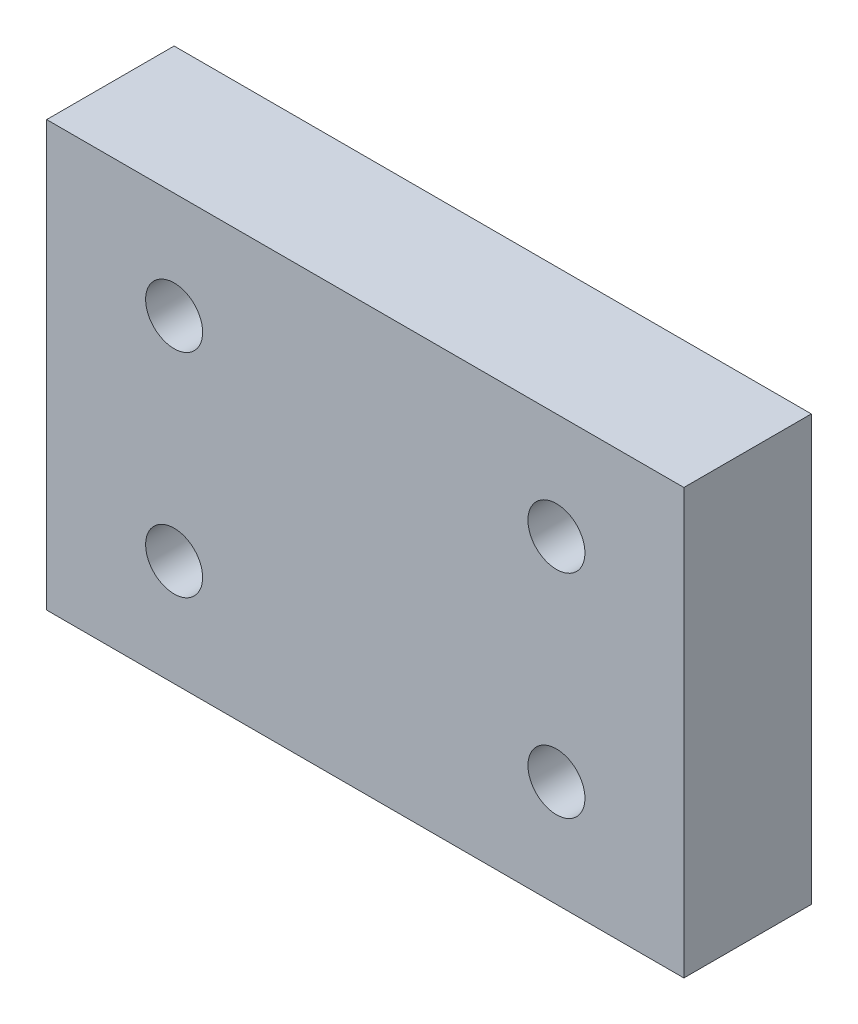
ISO-10303-21;
HEADER;
FILE_DESCRIPTION(('STEP AP214'),'2;1');
FILE_NAME('part.step','',(''),(''),'','','');
FILE_SCHEMA(('AUTOMOTIVE_DESIGN { 1 0 10303 214 1 1 1 1 }'));
ENDSEC;
DATA;
#1=APPLICATION_CONTEXT('core data for automotive mechanical design processes');
#2=APPLICATION_PROTOCOL_DEFINITION('international standard','automotive_design',2000,#1);
#3=PRODUCT_CONTEXT('',#1,'mechanical');
#4=PRODUCT('Part','Part','',(#3));
#5=PRODUCT_RELATED_PRODUCT_CATEGORY('part','',(#4));
#6=PRODUCT_DEFINITION_FORMATION('','',#4);
#7=PRODUCT_DEFINITION_CONTEXT('part definition',#1,'design');
#8=PRODUCT_DEFINITION('design','',#6,#7);
#9=PRODUCT_DEFINITION_SHAPE('','',#8);
#10=(LENGTH_UNIT() NAMED_UNIT(*) SI_UNIT(.MILLI.,.METRE.));
#11=(NAMED_UNIT(*) PLANE_ANGLE_UNIT() SI_UNIT($,.RADIAN.));
#12=(NAMED_UNIT(*) SI_UNIT($,.STERADIAN.) SOLID_ANGLE_UNIT());
#13=UNCERTAINTY_MEASURE_WITH_UNIT(LENGTH_MEASURE(1.E-05),#10,'distance_accuracy_value','');
#14=(GEOMETRIC_REPRESENTATION_CONTEXT(3) GLOBAL_UNCERTAINTY_ASSIGNED_CONTEXT((#13)) GLOBAL_UNIT_ASSIGNED_CONTEXT((#10,
#11,#12)) REPRESENTATION_CONTEXT('',''));
#15=CARTESIAN_POINT('',(0.,0.,0.));
#16=DIRECTION('',(0.,0.,1.));
#17=DIRECTION('',(1.,0.,0.));
#18=AXIS2_PLACEMENT_3D('',#15,#16,#17);
#19=CARTESIAN_POINT('',(0.,0.,6.));
#20=DIRECTION('',(0.,0.,-1.));
#21=DIRECTION('',(-1.,0.,0.));
#22=AXIS2_PLACEMENT_3D('',#19,#20,#21);
#23=PLANE('',#22);
#24=CARTESIAN_POINT('',(24.,5.,6.));
#25=DIRECTION('',(0.,0.,1.));
#26=DIRECTION('',(1.,0.,0.));
#27=AXIS2_PLACEMENT_3D('',#24,#25,#26);
#28=CIRCLE('',#27,1.34180855128207);
#29=CARTESIAN_POINT('',(25.3418085512821,5.,6.));
#30=VERTEX_POINT('',#29);
#31=EDGE_CURVE('E121',#30,#30,#28,.T.);
#32=ORIENTED_EDGE('',*,*,#31,.F.);
#33=EDGE_LOOP('',(#32));
#34=FACE_BOUND('',#33,.T.);
#35=CARTESIAN_POINT('',(6.,15.,6.));
#36=DIRECTION('',(0.,0.,1.));
#37=DIRECTION('',(1.,0.,0.));
#38=AXIS2_PLACEMENT_3D('',#35,#36,#37);
#39=CIRCLE('',#38,1.34180855128207);
#40=CARTESIAN_POINT('',(7.34180855128207,15.,6.));
#41=VERTEX_POINT('',#40);
#42=EDGE_CURVE('E100',#41,#41,#39,.T.);
#43=ORIENTED_EDGE('',*,*,#42,.F.);
#44=EDGE_LOOP('',(#43));
#45=FACE_BOUND('',#44,.T.);
#46=DIRECTION('',(0.,-1.,0.));
#47=VECTOR('',#46,1.);
#48=CARTESIAN_POINT('',(0.,0.,6.));
#49=LINE('',#48,#47);
#50=CARTESIAN_POINT('',(0.,20.,6.));
#51=VERTEX_POINT('',#50);
#52=CARTESIAN_POINT('',(0.,0.,6.));
#53=VERTEX_POINT('',#52);
#54=EDGE_CURVE('E85',#51,#53,#49,.T.);
#55=ORIENTED_EDGE('',*,*,#54,.T.);
#56=DIRECTION('',(1.,0.,0.));
#57=VECTOR('',#56,1.);
#58=CARTESIAN_POINT('',(0.,0.,6.));
#59=LINE('',#58,#57);
#60=CARTESIAN_POINT('',(30.,0.,6.));
#61=VERTEX_POINT('',#60);
#62=EDGE_CURVE('E80',#53,#61,#59,.T.);
#63=ORIENTED_EDGE('',*,*,#62,.T.);
#64=DIRECTION('',(0.,1.,0.));
#65=VECTOR('',#64,1.);
#66=CARTESIAN_POINT('',(30.,0.,6.));
#67=LINE('',#66,#65);
#68=CARTESIAN_POINT('',(30.,20.,6.));
#69=VERTEX_POINT('',#68);
#70=EDGE_CURVE('E83',#61,#69,#67,.T.);
#71=ORIENTED_EDGE('',*,*,#70,.T.);
#72=DIRECTION('',(-1.,0.,0.));
#73=VECTOR('',#72,1.);
#74=CARTESIAN_POINT('',(0.,20.,6.));
#75=LINE('',#74,#73);
#76=EDGE_CURVE('E50',#69,#51,#75,.T.);
#77=ORIENTED_EDGE('',*,*,#76,.T.);
#78=EDGE_LOOP('',(#55,#63,#71,#77));
#79=FACE_BOUND('',#78,.T.);
#80=CARTESIAN_POINT('',(24.,15.,6.));
#81=DIRECTION('',(0.,0.,1.));
#82=DIRECTION('',(-1.,0.,0.));
#83=AXIS2_PLACEMENT_3D('',#80,#81,#82);
#84=CIRCLE('',#83,1.34180855128207);
#85=CARTESIAN_POINT('',(22.6581914487179,15.,6.));
#86=VERTEX_POINT('',#85);
#87=EDGE_CURVE('E115',#86,#86,#84,.T.);
#88=ORIENTED_EDGE('',*,*,#87,.F.);
#89=EDGE_LOOP('',(#88));
#90=FACE_BOUND('',#89,.T.);
#91=CARTESIAN_POINT('',(6.,5.,6.));
#92=DIRECTION('',(0.,0.,1.));
#93=DIRECTION('',(-1.,0.,0.));
#94=AXIS2_PLACEMENT_3D('',#91,#92,#93);
#95=CIRCLE('',#94,1.34180855128207);
#96=CARTESIAN_POINT('',(4.65819144871793,5.,6.));
#97=VERTEX_POINT('',#96);
#98=EDGE_CURVE('E127',#97,#97,#95,.T.);
#99=ORIENTED_EDGE('',*,*,#98,.F.);
#100=EDGE_LOOP('',(#99));
#101=FACE_BOUND('',#100,.T.);
#102=ADVANCED_FACE('F33',(#34,#45,#79,#90,#101),#23,.F.);
#103=CARTESIAN_POINT('',(0.,0.,0.));
#104=DIRECTION('',(0.,0.,-1.));
#105=DIRECTION('',(-1.,0.,0.));
#106=AXIS2_PLACEMENT_3D('',#103,#104,#105);
#107=PLANE('',#106);
#108=CARTESIAN_POINT('',(24.,5.,0.));
#109=DIRECTION('',(0.,0.,1.));
#110=DIRECTION('',(1.,0.,0.));
#111=AXIS2_PLACEMENT_3D('',#108,#109,#110);
#112=CIRCLE('',#111,1.34180855128207);
#113=CARTESIAN_POINT('',(25.3418085512821,5.,0.));
#114=VERTEX_POINT('',#113);
#115=EDGE_CURVE('E124',#114,#114,#112,.T.);
#116=ORIENTED_EDGE('',*,*,#115,.T.);
#117=EDGE_LOOP('',(#116));
#118=FACE_BOUND('',#117,.T.);
#119=CARTESIAN_POINT('',(6.,15.,0.));
#120=DIRECTION('',(0.,0.,1.));
#121=DIRECTION('',(1.,0.,0.));
#122=AXIS2_PLACEMENT_3D('',#119,#120,#121);
#123=CIRCLE('',#122,1.34180855128207);
#124=CARTESIAN_POINT('',(7.34180855128207,15.,0.));
#125=VERTEX_POINT('',#124);
#126=EDGE_CURVE('E112',#125,#125,#123,.T.);
#127=ORIENTED_EDGE('',*,*,#126,.T.);
#128=EDGE_LOOP('',(#127));
#129=FACE_BOUND('',#128,.T.);
#130=DIRECTION('',(0.,-1.,0.));
#131=VECTOR('',#130,1.);
#132=CARTESIAN_POINT('',(0.,0.,0.));
#133=LINE('',#132,#131);
#134=CARTESIAN_POINT('',(0.,20.,0.));
#135=VERTEX_POINT('',#134);
#136=CARTESIAN_POINT('',(0.,0.,0.));
#137=VERTEX_POINT('',#136);
#138=EDGE_CURVE('E97',#135,#137,#133,.T.);
#139=ORIENTED_EDGE('',*,*,#138,.F.);
#140=DIRECTION('',(-1.,0.,0.));
#141=VECTOR('',#140,1.);
#142=CARTESIAN_POINT('',(0.,20.,0.));
#143=LINE('',#142,#141);
#144=CARTESIAN_POINT('',(30.,20.,0.));
#145=VERTEX_POINT('',#144);
#146=EDGE_CURVE('E73',#145,#135,#143,.T.);
#147=ORIENTED_EDGE('',*,*,#146,.F.);
#148=DIRECTION('',(0.,1.,0.));
#149=VECTOR('',#148,1.);
#150=CARTESIAN_POINT('',(30.,0.,0.));
#151=LINE('',#150,#149);
#152=CARTESIAN_POINT('',(30.,0.,0.));
#153=VERTEX_POINT('',#152);
#154=EDGE_CURVE('E67',#153,#145,#151,.T.);
#155=ORIENTED_EDGE('',*,*,#154,.F.);
#156=DIRECTION('',(1.,0.,0.));
#157=VECTOR('',#156,1.);
#158=CARTESIAN_POINT('',(0.,0.,0.));
#159=LINE('',#158,#157);
#160=EDGE_CURVE('E89',#137,#153,#159,.T.);
#161=ORIENTED_EDGE('',*,*,#160,.F.);
#162=EDGE_LOOP('',(#139,#147,#155,#161));
#163=FACE_BOUND('',#162,.T.);
#164=CARTESIAN_POINT('',(24.,15.,0.));
#165=DIRECTION('',(0.,0.,1.));
#166=DIRECTION('',(-1.,0.,0.));
#167=AXIS2_PLACEMENT_3D('',#164,#165,#166);
#168=CIRCLE('',#167,1.34180855128207);
#169=CARTESIAN_POINT('',(22.6581914487179,15.,0.));
#170=VERTEX_POINT('',#169);
#171=EDGE_CURVE('E118',#170,#170,#168,.T.);
#172=ORIENTED_EDGE('',*,*,#171,.T.);
#173=EDGE_LOOP('',(#172));
#174=FACE_BOUND('',#173,.T.);
#175=CARTESIAN_POINT('',(6.,5.,0.));
#176=DIRECTION('',(0.,0.,1.));
#177=DIRECTION('',(-1.,0.,0.));
#178=AXIS2_PLACEMENT_3D('',#175,#176,#177);
#179=CIRCLE('',#178,1.34180855128207);
#180=CARTESIAN_POINT('',(4.65819144871793,5.,0.));
#181=VERTEX_POINT('',#180);
#182=EDGE_CURVE('E130',#181,#181,#179,.T.);
#183=ORIENTED_EDGE('',*,*,#182,.T.);
#184=EDGE_LOOP('',(#183));
#185=FACE_BOUND('',#184,.T.);
#186=ADVANCED_FACE('F108',(#118,#129,#163,#174,#185),#107,.T.);
#187=CARTESIAN_POINT('',(0.,0.,6.));
#188=DIRECTION('',(1.,0.,0.));
#189=DIRECTION('',(0.,0.,-1.));
#190=AXIS2_PLACEMENT_3D('',#187,#188,#189);
#191=PLANE('',#190);
#192=ORIENTED_EDGE('',*,*,#138,.T.);
#193=DIRECTION('',(0.,0.,-1.));
#194=VECTOR('',#193,1.);
#195=CARTESIAN_POINT('',(0.,0.,6.));
#196=LINE('',#195,#194);
#197=EDGE_CURVE('E11',#53,#137,#196,.T.);
#198=ORIENTED_EDGE('',*,*,#197,.F.);
#199=ORIENTED_EDGE('',*,*,#54,.F.);
#200=DIRECTION('',(0.,0.,-1.));
#201=VECTOR('',#200,1.);
#202=CARTESIAN_POINT('',(0.,20.,6.));
#203=LINE('',#202,#201);
#204=EDGE_CURVE('E93',#51,#135,#203,.T.);
#205=ORIENTED_EDGE('',*,*,#204,.T.);
#206=EDGE_LOOP('',(#192,#198,#199,#205));
#207=FACE_BOUND('',#206,.T.);
#208=ADVANCED_FACE('F35',(#207),#191,.F.);
#209=CARTESIAN_POINT('',(0.,0.,6.));
#210=DIRECTION('',(0.,1.,0.));
#211=DIRECTION('',(0.,0.,1.));
#212=AXIS2_PLACEMENT_3D('',#209,#210,#211);
#213=PLANE('',#212);
#214=ORIENTED_EDGE('',*,*,#160,.T.);
#215=DIRECTION('',(0.,0.,-1.));
#216=VECTOR('',#215,1.);
#217=CARTESIAN_POINT('',(30.,0.,6.));
#218=LINE('',#217,#216);
#219=EDGE_CURVE('E42',#61,#153,#218,.T.);
#220=ORIENTED_EDGE('',*,*,#219,.F.);
#221=ORIENTED_EDGE('',*,*,#62,.F.);
#222=ORIENTED_EDGE('',*,*,#197,.T.);
#223=EDGE_LOOP('',(#214,#220,#221,#222));
#224=FACE_BOUND('',#223,.T.);
#225=ADVANCED_FACE('F88',(#224),#213,.F.);
#226=CARTESIAN_POINT('',(30.,0.,6.));
#227=DIRECTION('',(-1.,0.,0.));
#228=DIRECTION('',(0.,0.,1.));
#229=AXIS2_PLACEMENT_3D('',#226,#227,#228);
#230=PLANE('',#229);
#231=ORIENTED_EDGE('',*,*,#154,.T.);
#232=DIRECTION('',(0.,0.,-1.));
#233=VECTOR('',#232,1.);
#234=CARTESIAN_POINT('',(30.,20.,6.));
#235=LINE('',#234,#233);
#236=EDGE_CURVE('E90',#69,#145,#235,.T.);
#237=ORIENTED_EDGE('',*,*,#236,.F.);
#238=ORIENTED_EDGE('',*,*,#70,.F.);
#239=ORIENTED_EDGE('',*,*,#219,.T.);
#240=EDGE_LOOP('',(#231,#237,#238,#239));
#241=FACE_BOUND('',#240,.T.);
#242=ADVANCED_FACE('F91',(#241),#230,.F.);
#243=CARTESIAN_POINT('',(0.,20.,6.));
#244=DIRECTION('',(0.,-1.,0.));
#245=DIRECTION('',(0.,0.,-1.));
#246=AXIS2_PLACEMENT_3D('',#243,#244,#245);
#247=PLANE('',#246);
#248=ORIENTED_EDGE('',*,*,#146,.T.);
#249=ORIENTED_EDGE('',*,*,#204,.F.);
#250=ORIENTED_EDGE('',*,*,#76,.F.);
#251=ORIENTED_EDGE('',*,*,#236,.T.);
#252=EDGE_LOOP('',(#248,#249,#250,#251));
#253=FACE_BOUND('',#252,.T.);
#254=ADVANCED_FACE('F105',(#253),#247,.F.);
#255=CARTESIAN_POINT('',(6.,15.,6.));
#256=DIRECTION('',(0.,0.,-1.));
#257=DIRECTION('',(-1.,0.,0.));
#258=AXIS2_PLACEMENT_3D('',#255,#256,#257);
#259=CYLINDRICAL_SURFACE('',#258,1.34180855128207);
#260=ORIENTED_EDGE('',*,*,#42,.T.);
#261=EDGE_LOOP('',(#260));
#262=FACE_BOUND('',#261,.T.);
#263=ORIENTED_EDGE('',*,*,#126,.F.);
#264=EDGE_LOOP('',(#263));
#265=FACE_BOUND('',#264,.T.);
#266=ADVANCED_FACE('F150',(#262,#265),#259,.F.);
#267=CARTESIAN_POINT('',(24.,15.,6.));
#268=DIRECTION('',(0.,0.,-1.));
#269=DIRECTION('',(-1.,0.,0.));
#270=AXIS2_PLACEMENT_3D('',#267,#268,#269);
#271=CYLINDRICAL_SURFACE('',#270,1.34180855128207);
#272=ORIENTED_EDGE('',*,*,#87,.T.);
#273=EDGE_LOOP('',(#272));
#274=FACE_BOUND('',#273,.T.);
#275=ORIENTED_EDGE('',*,*,#171,.F.);
#276=EDGE_LOOP('',(#275));
#277=FACE_BOUND('',#276,.T.);
#278=ADVANCED_FACE('F196',(#274,#277),#271,.F.);
#279=CARTESIAN_POINT('',(24.,5.,6.));
#280=DIRECTION('',(0.,0.,-1.));
#281=DIRECTION('',(-1.,0.,0.));
#282=AXIS2_PLACEMENT_3D('',#279,#280,#281);
#283=CYLINDRICAL_SURFACE('',#282,1.34180855128207);
#284=ORIENTED_EDGE('',*,*,#31,.T.);
#285=EDGE_LOOP('',(#284));
#286=FACE_BOUND('',#285,.T.);
#287=ORIENTED_EDGE('',*,*,#115,.F.);
#288=EDGE_LOOP('',(#287));
#289=FACE_BOUND('',#288,.T.);
#290=ADVANCED_FACE('F204',(#286,#289),#283,.F.);
#291=CARTESIAN_POINT('',(6.,5.,6.));
#292=DIRECTION('',(0.,0.,-1.));
#293=DIRECTION('',(-1.,0.,0.));
#294=AXIS2_PLACEMENT_3D('',#291,#292,#293);
#295=CYLINDRICAL_SURFACE('',#294,1.34180855128207);
#296=ORIENTED_EDGE('',*,*,#98,.T.);
#297=EDGE_LOOP('',(#296));
#298=FACE_BOUND('',#297,.T.);
#299=ORIENTED_EDGE('',*,*,#182,.F.);
#300=EDGE_LOOP('',(#299));
#301=FACE_BOUND('',#300,.T.);
#302=ADVANCED_FACE('F136',(#298,#301),#295,.F.);
#303=CLOSED_SHELL('',(#102,#186,#208,#225,#242,#254,#266,#278,#290,#302));
#304=MANIFOLD_SOLID_BREP('B2',#303);
#305=ADVANCED_BREP_SHAPE_REPRESENTATION('',(#18,#304),#14);
#306=SHAPE_DEFINITION_REPRESENTATION(#9,#305);
ENDSEC;
END-ISO-10303-21;
